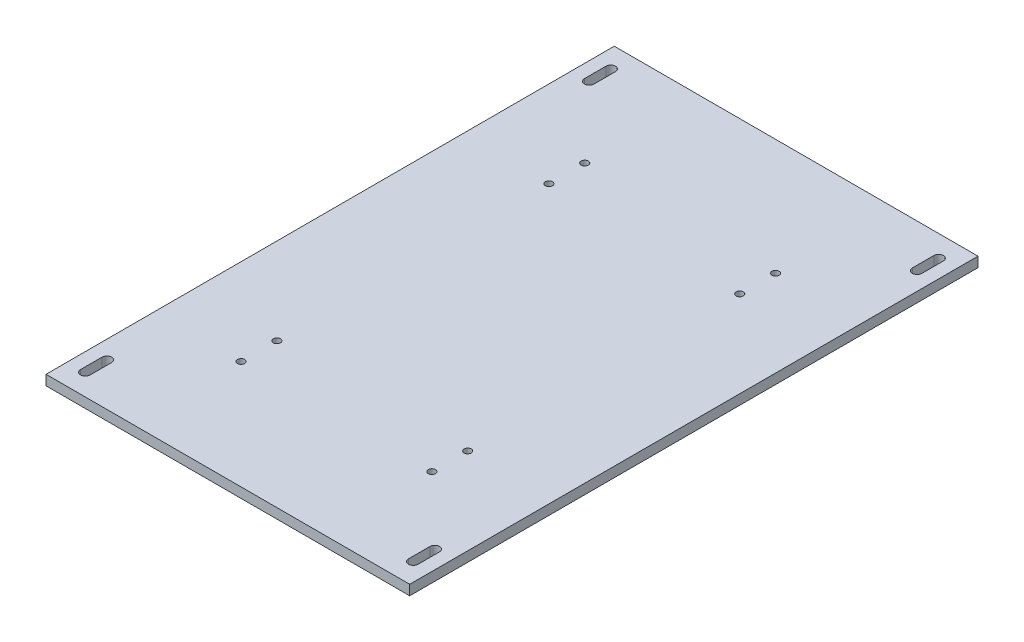
ISO-10303-21;
HEADER;
FILE_DESCRIPTION(('STEP AP214'),'2;1');
FILE_NAME('part.step','',(''),(''),'','','');
FILE_SCHEMA(('AUTOMOTIVE_DESIGN { 1 0 10303 214 1 1 1 1 }'));
ENDSEC;
DATA;
#1=APPLICATION_CONTEXT('core data for automotive mechanical design processes');
#2=APPLICATION_PROTOCOL_DEFINITION('international standard','automotive_design',2000,#1);
#3=PRODUCT_CONTEXT('',#1,'mechanical');
#4=PRODUCT('Part','Part','',(#3));
#5=PRODUCT_RELATED_PRODUCT_CATEGORY('part','',(#4));
#6=PRODUCT_DEFINITION_FORMATION('','',#4);
#7=PRODUCT_DEFINITION_CONTEXT('part definition',#1,'design');
#8=PRODUCT_DEFINITION('design','',#6,#7);
#9=PRODUCT_DEFINITION_SHAPE('','',#8);
#10=(LENGTH_UNIT() NAMED_UNIT(*) SI_UNIT(.MILLI.,.METRE.));
#11=(NAMED_UNIT(*) PLANE_ANGLE_UNIT() SI_UNIT($,.RADIAN.));
#12=(NAMED_UNIT(*) SI_UNIT($,.STERADIAN.) SOLID_ANGLE_UNIT());
#13=UNCERTAINTY_MEASURE_WITH_UNIT(LENGTH_MEASURE(1.E-05),#10,'distance_accuracy_value','');
#14=(GEOMETRIC_REPRESENTATION_CONTEXT(3) GLOBAL_UNCERTAINTY_ASSIGNED_CONTEXT((#13)) GLOBAL_UNIT_ASSIGNED_CONTEXT((#10,
#11,#12)) REPRESENTATION_CONTEXT('',''));
#15=CARTESIAN_POINT('',(0.,0.,0.));
#16=DIRECTION('',(0.,0.,1.));
#17=DIRECTION('',(1.,0.,0.));
#18=AXIS2_PLACEMENT_3D('',#15,#16,#17);
#19=CARTESIAN_POINT('',(0.,5.588,0.));
#20=DIRECTION('',(0.,-1.,0.));
#21=DIRECTION('',(0.,0.,-1.));
#22=AXIS2_PLACEMENT_3D('',#19,#20,#21);
#23=PLANE('',#22);
#24=DIRECTION('',(0.,0.,1.));
#25=VECTOR('',#24,1.);
#26=CARTESIAN_POINT('',(-88.95,5.588,146.75));
#27=LINE('',#26,#25);
#28=CARTESIAN_POINT('',(-88.95,5.588,134.75));
#29=VERTEX_POINT('',#28);
#30=CARTESIAN_POINT('',(-88.95,5.588,146.75));
#31=VERTEX_POINT('',#30);
#32=EDGE_CURVE('E184',#29,#31,#27,.T.);
#33=ORIENTED_EDGE('',*,*,#32,.T.);
#34=CARTESIAN_POINT('',(-91.6,5.588,146.75));
#35=DIRECTION('',(0.,-1.,0.));
#36=DIRECTION('',(0.,0.,1.));
#37=AXIS2_PLACEMENT_3D('',#34,#35,#36);
#38=CIRCLE('',#37,2.64999999999999);
#39=CARTESIAN_POINT('',(-94.25,5.588,146.75));
#40=VERTEX_POINT('',#39);
#41=EDGE_CURVE('E178',#31,#40,#38,.T.);
#42=ORIENTED_EDGE('',*,*,#41,.T.);
#43=DIRECTION('',(0.,0.,-1.));
#44=VECTOR('',#43,1.);
#45=CARTESIAN_POINT('',(-94.25,5.588,146.75));
#46=LINE('',#45,#44);
#47=CARTESIAN_POINT('',(-94.25,5.588,134.75));
#48=VERTEX_POINT('',#47);
#49=EDGE_CURVE('E187',#40,#48,#46,.T.);
#50=ORIENTED_EDGE('',*,*,#49,.T.);
#51=CARTESIAN_POINT('',(-91.6,5.588,134.75));
#52=DIRECTION('',(0.,-1.,0.));
#53=DIRECTION('',(0.,0.,1.));
#54=AXIS2_PLACEMENT_3D('',#51,#52,#53);
#55=CIRCLE('',#54,2.64999999999999);
#56=EDGE_CURVE('E54',#48,#29,#55,.T.);
#57=ORIENTED_EDGE('',*,*,#56,.T.);
#58=EDGE_LOOP('',(#33,#42,#50,#57));
#59=FACE_BOUND('',#58,.T.);
#60=CARTESIAN_POINT('',(91.6,5.588,146.75));
#61=DIRECTION('',(0.,1.,0.));
#62=DIRECTION('',(0.,0.,1.));
#63=AXIS2_PLACEMENT_3D('',#60,#61,#62);
#64=CIRCLE('',#63,2.64999999999999);
#65=CARTESIAN_POINT('',(88.95,5.588,146.75));
#66=VERTEX_POINT('',#65);
#67=CARTESIAN_POINT('',(94.25,5.588,146.75));
#68=VERTEX_POINT('',#67);
#69=EDGE_CURVE('E243',#66,#68,#64,.T.);
#70=ORIENTED_EDGE('',*,*,#69,.F.);
#71=DIRECTION('',(0.,0.,1.));
#72=VECTOR('',#71,1.);
#73=CARTESIAN_POINT('',(88.95,5.588,146.75));
#74=LINE('',#73,#72);
#75=CARTESIAN_POINT('',(88.95,5.588,134.75));
#76=VERTEX_POINT('',#75);
#77=EDGE_CURVE('E245',#76,#66,#74,.T.);
#78=ORIENTED_EDGE('',*,*,#77,.F.);
#79=CARTESIAN_POINT('',(91.6,5.588,134.75));
#80=DIRECTION('',(0.,1.,0.));
#81=DIRECTION('',(0.,0.,1.));
#82=AXIS2_PLACEMENT_3D('',#79,#80,#81);
#83=CIRCLE('',#82,2.64999999999999);
#84=CARTESIAN_POINT('',(94.25,5.588,134.75));
#85=VERTEX_POINT('',#84);
#86=EDGE_CURVE('E248',#85,#76,#83,.T.);
#87=ORIENTED_EDGE('',*,*,#86,.F.);
#88=DIRECTION('',(0.,0.,-1.));
#89=VECTOR('',#88,1.);
#90=CARTESIAN_POINT('',(94.25,5.588,146.75));
#91=LINE('',#90,#89);
#92=EDGE_CURVE('E251',#68,#85,#91,.T.);
#93=ORIENTED_EDGE('',*,*,#92,.F.);
#94=EDGE_LOOP('',(#70,#78,#87,#93));
#95=FACE_BOUND('',#94,.T.);
#96=DIRECTION('',(0.,0.,-1.));
#97=VECTOR('',#96,1.);
#98=CARTESIAN_POINT('',(88.95,5.588,-146.75));
#99=LINE('',#98,#97);
#100=CARTESIAN_POINT('',(88.95,5.588,-134.75));
#101=VERTEX_POINT('',#100);
#102=CARTESIAN_POINT('',(88.95,5.588,-146.75));
#103=VERTEX_POINT('',#102);
#104=EDGE_CURVE('E283',#101,#103,#99,.T.);
#105=ORIENTED_EDGE('',*,*,#104,.T.);
#106=CARTESIAN_POINT('',(91.6,5.588,-146.75));
#107=DIRECTION('',(0.,-1.,0.));
#108=DIRECTION('',(0.,0.,-1.));
#109=AXIS2_PLACEMENT_3D('',#106,#107,#108);
#110=CIRCLE('',#109,2.64999999999999);
#111=CARTESIAN_POINT('',(94.25,5.588,-146.75));
#112=VERTEX_POINT('',#111);
#113=EDGE_CURVE('E274',#103,#112,#110,.T.);
#114=ORIENTED_EDGE('',*,*,#113,.T.);
#115=DIRECTION('',(0.,0.,1.));
#116=VECTOR('',#115,1.);
#117=CARTESIAN_POINT('',(94.25,5.588,-146.75));
#118=LINE('',#117,#116);
#119=CARTESIAN_POINT('',(94.25,5.588,-134.75));
#120=VERTEX_POINT('',#119);
#121=EDGE_CURVE('E277',#112,#120,#118,.T.);
#122=ORIENTED_EDGE('',*,*,#121,.T.);
#123=CARTESIAN_POINT('',(91.6,5.588,-134.75));
#124=DIRECTION('',(0.,-1.,0.));
#125=DIRECTION('',(0.,0.,-1.));
#126=AXIS2_PLACEMENT_3D('',#123,#124,#125);
#127=CIRCLE('',#126,2.64999999999999);
#128=EDGE_CURVE('E280',#120,#101,#127,.T.);
#129=ORIENTED_EDGE('',*,*,#128,.T.);
#130=EDGE_LOOP('',(#105,#114,#122,#129));
#131=FACE_BOUND('',#130,.T.);
#132=CARTESIAN_POINT('',(-53.3,5.588,-93.936114690721));
#133=DIRECTION('',(0.,1.,0.));
#134=DIRECTION('',(0.,0.,-1.));
#135=AXIS2_PLACEMENT_3D('',#132,#133,#134);
#136=CIRCLE('',#135,1.99999999999994);
#137=CARTESIAN_POINT('',(-53.3,5.588,-95.9361146907209));
#138=VERTEX_POINT('',#137);
#139=EDGE_CURVE('E305',#138,#138,#136,.T.);
#140=ORIENTED_EDGE('',*,*,#139,.F.);
#141=EDGE_LOOP('',(#140));
#142=FACE_BOUND('',#141,.T.);
#143=CARTESIAN_POINT('',(-53.300000000425,5.588,-73.936114690721));
#144=DIRECTION('',(0.,1.,0.));
#145=DIRECTION('',(0.,0.,-1.));
#146=AXIS2_PLACEMENT_3D('',#143,#144,#145);
#147=CIRCLE('',#146,2.);
#148=CARTESIAN_POINT('',(-53.300000000425,5.588,-75.936114690721));
#149=VERTEX_POINT('',#148);
#150=EDGE_CURVE('E312',#149,#149,#147,.T.);
#151=ORIENTED_EDGE('',*,*,#150,.F.);
#152=EDGE_LOOP('',(#151));
#153=FACE_BOUND('',#152,.T.);
#154=CARTESIAN_POINT('',(-53.3000000000001,5.588,78.063885309279));
#155=DIRECTION('',(0.,1.,0.));
#156=DIRECTION('',(0.,0.,-1.));
#157=AXIS2_PLACEMENT_3D('',#154,#155,#156);
#158=CIRCLE('',#157,2.00000000406199);
#159=CARTESIAN_POINT('',(-53.3000000000001,5.588,76.063885305217));
#160=VERTEX_POINT('',#159);
#161=EDGE_CURVE('E318',#160,#160,#158,.T.);
#162=ORIENTED_EDGE('',*,*,#161,.F.);
#163=EDGE_LOOP('',(#162));
#164=FACE_BOUND('',#163,.T.);
#165=CARTESIAN_POINT('',(-53.3000000000001,5.588,98.063885309279));
#166=DIRECTION('',(0.,1.,0.));
#167=DIRECTION('',(0.,0.,-1.));
#168=AXIS2_PLACEMENT_3D('',#165,#166,#167);
#169=CIRCLE('',#168,2.);
#170=CARTESIAN_POINT('',(-53.3000000000001,5.588,96.063885309279));
#171=VERTEX_POINT('',#170);
#172=EDGE_CURVE('E324',#171,#171,#169,.T.);
#173=ORIENTED_EDGE('',*,*,#172,.F.);
#174=EDGE_LOOP('',(#173));
#175=FACE_BOUND('',#174,.T.);
#176=CARTESIAN_POINT('',(53.3,5.588,-93.936114690721));
#177=DIRECTION('',(0.,-1.,0.));
#178=DIRECTION('',(0.,0.,-1.));
#179=AXIS2_PLACEMENT_3D('',#176,#177,#178);
#180=CIRCLE('',#179,1.99999999999994);
#181=CARTESIAN_POINT('',(53.3,5.588,-95.9361146907209));
#182=VERTEX_POINT('',#181);
#183=EDGE_CURVE('E329',#182,#182,#180,.T.);
#184=ORIENTED_EDGE('',*,*,#183,.T.);
#185=EDGE_LOOP('',(#184));
#186=FACE_BOUND('',#185,.T.);
#187=CARTESIAN_POINT('',(53.300000000425,5.588,-73.936114690721));
#188=DIRECTION('',(0.,-1.,0.));
#189=DIRECTION('',(0.,0.,-1.));
#190=AXIS2_PLACEMENT_3D('',#187,#188,#189);
#191=CIRCLE('',#190,2.);
#192=CARTESIAN_POINT('',(53.300000000425,5.588,-75.936114690721));
#193=VERTEX_POINT('',#192);
#194=EDGE_CURVE('E339',#193,#193,#191,.T.);
#195=ORIENTED_EDGE('',*,*,#194,.T.);
#196=EDGE_LOOP('',(#195));
#197=FACE_BOUND('',#196,.T.);
#198=CARTESIAN_POINT('',(53.3000000000001,5.588,78.063885309279));
#199=DIRECTION('',(0.,-1.,0.));
#200=DIRECTION('',(0.,0.,-1.));
#201=AXIS2_PLACEMENT_3D('',#198,#199,#200);
#202=CIRCLE('',#201,2.00000000406199);
#203=CARTESIAN_POINT('',(53.3000000000001,5.588,76.063885305217));
#204=VERTEX_POINT('',#203);
#205=EDGE_CURVE('E345',#204,#204,#202,.T.);
#206=ORIENTED_EDGE('',*,*,#205,.T.);
#207=EDGE_LOOP('',(#206));
#208=FACE_BOUND('',#207,.T.);
#209=CARTESIAN_POINT('',(53.3000000000001,5.588,98.063885309279));
#210=DIRECTION('',(0.,-1.,0.));
#211=DIRECTION('',(0.,0.,-1.));
#212=AXIS2_PLACEMENT_3D('',#209,#210,#211);
#213=CIRCLE('',#212,2.);
#214=CARTESIAN_POINT('',(53.3000000000001,5.588,96.063885309279));
#215=VERTEX_POINT('',#214);
#216=EDGE_CURVE('E308',#215,#215,#213,.T.);
#217=ORIENTED_EDGE('',*,*,#216,.T.);
#218=EDGE_LOOP('',(#217));
#219=FACE_BOUND('',#218,.T.);
#220=DIRECTION('',(0.,0.,-1.));
#221=VECTOR('',#220,1.);
#222=CARTESIAN_POINT('',(101.6,5.588,158.75));
#223=LINE('',#222,#221);
#224=CARTESIAN_POINT('',(101.6,5.588,158.75));
#225=VERTEX_POINT('',#224);
#226=CARTESIAN_POINT('',(101.6,5.588,-158.75));
#227=VERTEX_POINT('',#226);
#228=EDGE_CURVE('E353',#225,#227,#223,.T.);
#229=ORIENTED_EDGE('',*,*,#228,.T.);
#230=DIRECTION('',(-1.,0.,0.));
#231=VECTOR('',#230,1.);
#232=CARTESIAN_POINT('',(-101.6,5.588,-158.75));
#233=LINE('',#232,#231);
#234=CARTESIAN_POINT('',(-101.6,5.588,-158.75));
#235=VERTEX_POINT('',#234);
#236=EDGE_CURVE('E356',#227,#235,#233,.T.);
#237=ORIENTED_EDGE('',*,*,#236,.T.);
#238=DIRECTION('',(0.,0.,1.));
#239=VECTOR('',#238,1.);
#240=CARTESIAN_POINT('',(-101.6,5.588,158.75));
#241=LINE('',#240,#239);
#242=CARTESIAN_POINT('',(-101.6,5.588,158.75));
#243=VERTEX_POINT('',#242);
#244=EDGE_CURVE('E359',#235,#243,#241,.T.);
#245=ORIENTED_EDGE('',*,*,#244,.T.);
#246=DIRECTION('',(1.,0.,0.));
#247=VECTOR('',#246,1.);
#248=CARTESIAN_POINT('',(-101.6,5.588,158.75));
#249=LINE('',#248,#247);
#250=EDGE_CURVE('E361',#243,#225,#249,.T.);
#251=ORIENTED_EDGE('',*,*,#250,.T.);
#252=EDGE_LOOP('',(#229,#237,#245,#251));
#253=FACE_BOUND('',#252,.T.);
#254=CARTESIAN_POINT('',(-91.6,5.588,-146.75));
#255=DIRECTION('',(0.,1.,0.));
#256=DIRECTION('',(0.,0.,-1.));
#257=AXIS2_PLACEMENT_3D('',#254,#255,#256);
#258=CIRCLE('',#257,2.64999999999999);
#259=CARTESIAN_POINT('',(-88.95,5.588,-146.75));
#260=VERTEX_POINT('',#259);
#261=CARTESIAN_POINT('',(-94.25,5.588,-146.75));
#262=VERTEX_POINT('',#261);
#263=EDGE_CURVE('E212',#260,#262,#258,.T.);
#264=ORIENTED_EDGE('',*,*,#263,.F.);
#265=DIRECTION('',(0.,0.,-1.));
#266=VECTOR('',#265,1.);
#267=CARTESIAN_POINT('',(-88.95,5.588,-146.75));
#268=LINE('',#267,#266);
#269=CARTESIAN_POINT('',(-88.95,5.588,-134.75));
#270=VERTEX_POINT('',#269);
#271=EDGE_CURVE('E214',#270,#260,#268,.T.);
#272=ORIENTED_EDGE('',*,*,#271,.F.);
#273=CARTESIAN_POINT('',(-91.6,5.588,-134.75));
#274=DIRECTION('',(0.,1.,0.));
#275=DIRECTION('',(0.,0.,-1.));
#276=AXIS2_PLACEMENT_3D('',#273,#274,#275);
#277=CIRCLE('',#276,2.64999999999999);
#278=CARTESIAN_POINT('',(-94.25,5.588,-134.75));
#279=VERTEX_POINT('',#278);
#280=EDGE_CURVE('E217',#279,#270,#277,.T.);
#281=ORIENTED_EDGE('',*,*,#280,.F.);
#282=DIRECTION('',(0.,0.,1.));
#283=VECTOR('',#282,1.);
#284=CARTESIAN_POINT('',(-94.25,5.588,-146.75));
#285=LINE('',#284,#283);
#286=EDGE_CURVE('E220',#262,#279,#285,.T.);
#287=ORIENTED_EDGE('',*,*,#286,.F.);
#288=EDGE_LOOP('',(#264,#272,#281,#287));
#289=FACE_BOUND('',#288,.T.);
#290=ADVANCED_FACE('F39',(#59,#95,#131,#142,#153,#164,#175,#186,#197,#208,#219,#253,#289),#23,.F.);
#291=CARTESIAN_POINT('',(0.,0.,0.));
#292=DIRECTION('',(0.,-1.,0.));
#293=DIRECTION('',(0.,0.,-1.));
#294=AXIS2_PLACEMENT_3D('',#291,#292,#293);
#295=PLANE('',#294);
#296=CARTESIAN_POINT('',(-91.6,0.,146.75));
#297=DIRECTION('',(0.,-1.,0.));
#298=DIRECTION('',(0.,0.,1.));
#299=AXIS2_PLACEMENT_3D('',#296,#297,#298);
#300=CIRCLE('',#299,2.64999999999999);
#301=CARTESIAN_POINT('',(-88.95,0.,146.75));
#302=VERTEX_POINT('',#301);
#303=CARTESIAN_POINT('',(-94.25,0.,146.75));
#304=VERTEX_POINT('',#303);
#305=EDGE_CURVE('E62',#302,#304,#300,.T.);
#306=ORIENTED_EDGE('',*,*,#305,.F.);
#307=DIRECTION('',(0.,0.,1.));
#308=VECTOR('',#307,1.);
#309=CARTESIAN_POINT('',(-88.95,0.,146.75));
#310=LINE('',#309,#308);
#311=CARTESIAN_POINT('',(-88.95,0.,134.75));
#312=VERTEX_POINT('',#311);
#313=EDGE_CURVE('E193',#312,#302,#310,.T.);
#314=ORIENTED_EDGE('',*,*,#313,.F.);
#315=CARTESIAN_POINT('',(-91.6,0.,134.75));
#316=DIRECTION('',(0.,-1.,0.));
#317=DIRECTION('',(0.,0.,1.));
#318=AXIS2_PLACEMENT_3D('',#315,#316,#317);
#319=CIRCLE('',#318,2.64999999999999);
#320=CARTESIAN_POINT('',(-94.25,0.,134.75));
#321=VERTEX_POINT('',#320);
#322=EDGE_CURVE('E196',#321,#312,#319,.T.);
#323=ORIENTED_EDGE('',*,*,#322,.F.);
#324=DIRECTION('',(0.,0.,-1.));
#325=VECTOR('',#324,1.);
#326=CARTESIAN_POINT('',(-94.25,0.,146.75));
#327=LINE('',#326,#325);
#328=EDGE_CURVE('E202',#304,#321,#327,.T.);
#329=ORIENTED_EDGE('',*,*,#328,.F.);
#330=EDGE_LOOP('',(#306,#314,#323,#329));
#331=FACE_BOUND('',#330,.T.);
#332=CARTESIAN_POINT('',(91.6,0.,-146.75));
#333=DIRECTION('',(0.,-1.,0.));
#334=DIRECTION('',(0.,0.,-1.));
#335=AXIS2_PLACEMENT_3D('',#332,#333,#334);
#336=CIRCLE('',#335,2.64999999999999);
#337=CARTESIAN_POINT('',(88.95,0.,-146.75));
#338=VERTEX_POINT('',#337);
#339=CARTESIAN_POINT('',(94.25,0.,-146.75));
#340=VERTEX_POINT('',#339);
#341=EDGE_CURVE('E267',#338,#340,#336,.T.);
#342=ORIENTED_EDGE('',*,*,#341,.F.);
#343=DIRECTION('',(0.,0.,-1.));
#344=VECTOR('',#343,1.);
#345=CARTESIAN_POINT('',(88.95,0.,-146.75));
#346=LINE('',#345,#344);
#347=CARTESIAN_POINT('',(88.95,0.,-134.75));
#348=VERTEX_POINT('',#347);
#349=EDGE_CURVE('E278',#348,#338,#346,.T.);
#350=ORIENTED_EDGE('',*,*,#349,.F.);
#351=CARTESIAN_POINT('',(91.6,0.,-134.75));
#352=DIRECTION('',(0.,-1.,0.));
#353=DIRECTION('',(0.,0.,-1.));
#354=AXIS2_PLACEMENT_3D('',#351,#352,#353);
#355=CIRCLE('',#354,2.64999999999999);
#356=CARTESIAN_POINT('',(94.25,0.,-134.75));
#357=VERTEX_POINT('',#356);
#358=EDGE_CURVE('E290',#357,#348,#355,.T.);
#359=ORIENTED_EDGE('',*,*,#358,.F.);
#360=DIRECTION('',(0.,0.,1.));
#361=VECTOR('',#360,1.);
#362=CARTESIAN_POINT('',(94.25,0.,-146.75));
#363=LINE('',#362,#361);
#364=EDGE_CURVE('E288',#340,#357,#363,.T.);
#365=ORIENTED_EDGE('',*,*,#364,.F.);
#366=EDGE_LOOP('',(#342,#350,#359,#365));
#367=FACE_BOUND('',#366,.T.);
#368=CARTESIAN_POINT('',(-53.3,0.,-93.936114690721));
#369=DIRECTION('',(0.,1.,0.));
#370=DIRECTION('',(0.,0.,-1.));
#371=AXIS2_PLACEMENT_3D('',#368,#369,#370);
#372=CIRCLE('',#371,1.99999999999994);
#373=CARTESIAN_POINT('',(-53.3,0.,-95.9361146907209));
#374=VERTEX_POINT('',#373);
#375=EDGE_CURVE('E309',#374,#374,#372,.T.);
#376=ORIENTED_EDGE('',*,*,#375,.T.);
#377=EDGE_LOOP('',(#376));
#378=FACE_BOUND('',#377,.T.);
#379=CARTESIAN_POINT('',(-53.300000000425,0.,-73.936114690721));
#380=DIRECTION('',(0.,1.,0.));
#381=DIRECTION('',(0.,0.,-1.));
#382=AXIS2_PLACEMENT_3D('',#379,#380,#381);
#383=CIRCLE('',#382,2.);
#384=CARTESIAN_POINT('',(-53.300000000425,0.,-75.936114690721));
#385=VERTEX_POINT('',#384);
#386=EDGE_CURVE('E315',#385,#385,#383,.T.);
#387=ORIENTED_EDGE('',*,*,#386,.T.);
#388=EDGE_LOOP('',(#387));
#389=FACE_BOUND('',#388,.T.);
#390=CARTESIAN_POINT('',(-53.3000000000001,0.,78.063885309279));
#391=DIRECTION('',(0.,1.,0.));
#392=DIRECTION('',(0.,0.,-1.));
#393=AXIS2_PLACEMENT_3D('',#390,#391,#392);
#394=CIRCLE('',#393,2.00000000406199);
#395=CARTESIAN_POINT('',(-53.3000000000001,0.,76.063885305217));
#396=VERTEX_POINT('',#395);
#397=EDGE_CURVE('E321',#396,#396,#394,.T.);
#398=ORIENTED_EDGE('',*,*,#397,.T.);
#399=EDGE_LOOP('',(#398));
#400=FACE_BOUND('',#399,.T.);
#401=CARTESIAN_POINT('',(-53.3000000000001,0.,98.063885309279));
#402=DIRECTION('',(0.,1.,0.));
#403=DIRECTION('',(0.,0.,-1.));
#404=AXIS2_PLACEMENT_3D('',#401,#402,#403);
#405=CIRCLE('',#404,2.);
#406=CARTESIAN_POINT('',(-53.3000000000001,0.,96.063885309279));
#407=VERTEX_POINT('',#406);
#408=EDGE_CURVE('E297',#407,#407,#405,.T.);
#409=ORIENTED_EDGE('',*,*,#408,.T.);
#410=EDGE_LOOP('',(#409));
#411=FACE_BOUND('',#410,.T.);
#412=CARTESIAN_POINT('',(53.3,0.,-93.936114690721));
#413=DIRECTION('',(0.,-1.,0.));
#414=DIRECTION('',(0.,0.,-1.));
#415=AXIS2_PLACEMENT_3D('',#412,#413,#414);
#416=CIRCLE('',#415,1.99999999999994);
#417=CARTESIAN_POINT('',(53.3,0.,-95.9361146907209));
#418=VERTEX_POINT('',#417);
#419=EDGE_CURVE('E333',#418,#418,#416,.T.);
#420=ORIENTED_EDGE('',*,*,#419,.F.);
#421=EDGE_LOOP('',(#420));
#422=FACE_BOUND('',#421,.T.);
#423=CARTESIAN_POINT('',(53.300000000425,0.,-73.936114690721));
#424=DIRECTION('',(0.,-1.,0.));
#425=DIRECTION('',(0.,0.,-1.));
#426=AXIS2_PLACEMENT_3D('',#423,#424,#425);
#427=CIRCLE('',#426,2.);
#428=CARTESIAN_POINT('',(53.300000000425,0.,-75.936114690721));
#429=VERTEX_POINT('',#428);
#430=EDGE_CURVE('E336',#429,#429,#427,.T.);
#431=ORIENTED_EDGE('',*,*,#430,.F.);
#432=EDGE_LOOP('',(#431));
#433=FACE_BOUND('',#432,.T.);
#434=CARTESIAN_POINT('',(53.3000000000001,0.,78.063885309279));
#435=DIRECTION('',(0.,-1.,0.));
#436=DIRECTION('',(0.,0.,-1.));
#437=AXIS2_PLACEMENT_3D('',#434,#435,#436);
#438=CIRCLE('',#437,2.00000000406199);
#439=CARTESIAN_POINT('',(53.3000000000001,0.,76.063885305217));
#440=VERTEX_POINT('',#439);
#441=EDGE_CURVE('E342',#440,#440,#438,.T.);
#442=ORIENTED_EDGE('',*,*,#441,.F.);
#443=EDGE_LOOP('',(#442));
#444=FACE_BOUND('',#443,.T.);
#445=CARTESIAN_POINT('',(53.3000000000001,0.,98.063885309279));
#446=DIRECTION('',(0.,-1.,0.));
#447=DIRECTION('',(0.,0.,-1.));
#448=AXIS2_PLACEMENT_3D('',#445,#446,#447);
#449=CIRCLE('',#448,2.);
#450=CARTESIAN_POINT('',(53.3000000000001,0.,96.063885309279));
#451=VERTEX_POINT('',#450);
#452=EDGE_CURVE('E348',#451,#451,#449,.T.);
#453=ORIENTED_EDGE('',*,*,#452,.F.);
#454=EDGE_LOOP('',(#453));
#455=FACE_BOUND('',#454,.T.);
#456=DIRECTION('',(0.,0.,-1.));
#457=VECTOR('',#456,1.);
#458=CARTESIAN_POINT('',(101.6,0.,158.75));
#459=LINE('',#458,#457);
#460=CARTESIAN_POINT('',(101.6,0.,158.75));
#461=VERTEX_POINT('',#460);
#462=CARTESIAN_POINT('',(101.6,0.,-158.75));
#463=VERTEX_POINT('',#462);
#464=EDGE_CURVE('E332',#461,#463,#459,.T.);
#465=ORIENTED_EDGE('',*,*,#464,.F.);
#466=DIRECTION('',(1.,0.,0.));
#467=VECTOR('',#466,1.);
#468=CARTESIAN_POINT('',(-101.6,0.,158.75));
#469=LINE('',#468,#467);
#470=CARTESIAN_POINT('',(-101.6,0.,158.75));
#471=VERTEX_POINT('',#470);
#472=EDGE_CURVE('E357',#471,#461,#469,.T.);
#473=ORIENTED_EDGE('',*,*,#472,.F.);
#474=DIRECTION('',(0.,0.,1.));
#475=VECTOR('',#474,1.);
#476=CARTESIAN_POINT('',(-101.6,0.,158.75));
#477=LINE('',#476,#475);
#478=CARTESIAN_POINT('',(-101.6,0.,-158.75));
#479=VERTEX_POINT('',#478);
#480=EDGE_CURVE('E368',#479,#471,#477,.T.);
#481=ORIENTED_EDGE('',*,*,#480,.F.);
#482=DIRECTION('',(-1.,0.,0.));
#483=VECTOR('',#482,1.);
#484=CARTESIAN_POINT('',(-101.6,0.,-158.75));
#485=LINE('',#484,#483);
#486=EDGE_CURVE('E366',#463,#479,#485,.T.);
#487=ORIENTED_EDGE('',*,*,#486,.F.);
#488=EDGE_LOOP('',(#465,#473,#481,#487));
#489=FACE_BOUND('',#488,.T.);
#490=DIRECTION('',(0.,0.,1.));
#491=VECTOR('',#490,1.);
#492=CARTESIAN_POINT('',(88.95,0.,146.75));
#493=LINE('',#492,#491);
#494=CARTESIAN_POINT('',(88.95,0.,134.75));
#495=VERTEX_POINT('',#494);
#496=CARTESIAN_POINT('',(88.95,0.,146.75));
#497=VERTEX_POINT('',#496);
#498=EDGE_CURVE('E256',#495,#497,#493,.T.);
#499=ORIENTED_EDGE('',*,*,#498,.T.);
#500=CARTESIAN_POINT('',(91.6,0.,146.75));
#501=DIRECTION('',(0.,1.,0.));
#502=DIRECTION('',(0.,0.,1.));
#503=AXIS2_PLACEMENT_3D('',#500,#501,#502);
#504=CIRCLE('',#503,2.64999999999999);
#505=CARTESIAN_POINT('',(94.25,0.,146.75));
#506=VERTEX_POINT('',#505);
#507=EDGE_CURVE('E236',#497,#506,#504,.T.);
#508=ORIENTED_EDGE('',*,*,#507,.T.);
#509=DIRECTION('',(0.,0.,-1.));
#510=VECTOR('',#509,1.);
#511=CARTESIAN_POINT('',(94.25,0.,146.75));
#512=LINE('',#511,#510);
#513=CARTESIAN_POINT('',(94.25,0.,134.75));
#514=VERTEX_POINT('',#513);
#515=EDGE_CURVE('E246',#506,#514,#512,.T.);
#516=ORIENTED_EDGE('',*,*,#515,.T.);
#517=CARTESIAN_POINT('',(91.6,0.,134.75));
#518=DIRECTION('',(0.,1.,0.));
#519=DIRECTION('',(0.,0.,1.));
#520=AXIS2_PLACEMENT_3D('',#517,#518,#519);
#521=CIRCLE('',#520,2.64999999999999);
#522=EDGE_CURVE('E259',#514,#495,#521,.T.);
#523=ORIENTED_EDGE('',*,*,#522,.T.);
#524=EDGE_LOOP('',(#499,#508,#516,#523));
#525=FACE_BOUND('',#524,.T.);
#526=DIRECTION('',(0.,0.,-1.));
#527=VECTOR('',#526,1.);
#528=CARTESIAN_POINT('',(-88.95,0.,-146.75));
#529=LINE('',#528,#527);
#530=CARTESIAN_POINT('',(-88.95,0.,-134.75));
#531=VERTEX_POINT('',#530);
#532=CARTESIAN_POINT('',(-88.95,0.,-146.75));
#533=VERTEX_POINT('',#532);
#534=EDGE_CURVE('E225',#531,#533,#529,.T.);
#535=ORIENTED_EDGE('',*,*,#534,.T.);
#536=CARTESIAN_POINT('',(-91.6,0.,-146.75));
#537=DIRECTION('',(0.,1.,0.));
#538=DIRECTION('',(0.,0.,-1.));
#539=AXIS2_PLACEMENT_3D('',#536,#537,#538);
#540=CIRCLE('',#539,2.64999999999999);
#541=CARTESIAN_POINT('',(-94.25,0.,-146.75));
#542=VERTEX_POINT('',#541);
#543=EDGE_CURVE('E208',#533,#542,#540,.T.);
#544=ORIENTED_EDGE('',*,*,#543,.T.);
#545=DIRECTION('',(0.,0.,1.));
#546=VECTOR('',#545,1.);
#547=CARTESIAN_POINT('',(-94.25,0.,-146.75));
#548=LINE('',#547,#546);
#549=CARTESIAN_POINT('',(-94.25,0.,-134.75));
#550=VERTEX_POINT('',#549);
#551=EDGE_CURVE('E215',#542,#550,#548,.T.);
#552=ORIENTED_EDGE('',*,*,#551,.T.);
#553=CARTESIAN_POINT('',(-91.6,0.,-134.75));
#554=DIRECTION('',(0.,1.,0.));
#555=DIRECTION('',(0.,0.,-1.));
#556=AXIS2_PLACEMENT_3D('',#553,#554,#555);
#557=CIRCLE('',#556,2.64999999999999);
#558=EDGE_CURVE('E228',#550,#531,#557,.T.);
#559=ORIENTED_EDGE('',*,*,#558,.T.);
#560=EDGE_LOOP('',(#535,#544,#552,#559));
#561=FACE_BOUND('',#560,.T.);
#562=ADVANCED_FACE('F386',(#331,#367,#378,#389,#400,#411,#422,#433,#444,#455,#489,#525,#561),
#295,.T.);
#563=CARTESIAN_POINT('',(101.6,5.588,158.75));
#564=DIRECTION('',(-1.,0.,0.));
#565=DIRECTION('',(0.,0.,1.));
#566=AXIS2_PLACEMENT_3D('',#563,#564,#565);
#567=PLANE('',#566);
#568=ORIENTED_EDGE('',*,*,#464,.T.);
#569=DIRECTION('',(0.,-1.,0.));
#570=VECTOR('',#569,1.);
#571=CARTESIAN_POINT('',(101.6,5.588,-158.75));
#572=LINE('',#571,#570);
#573=EDGE_CURVE('E11',#227,#463,#572,.T.);
#574=ORIENTED_EDGE('',*,*,#573,.F.);
#575=ORIENTED_EDGE('',*,*,#228,.F.);
#576=DIRECTION('',(0.,-1.,0.));
#577=VECTOR('',#576,1.);
#578=CARTESIAN_POINT('',(101.6,5.588,158.75));
#579=LINE('',#578,#577);
#580=EDGE_CURVE('E363',#225,#461,#579,.T.);
#581=ORIENTED_EDGE('',*,*,#580,.T.);
#582=EDGE_LOOP('',(#568,#574,#575,#581));
#583=FACE_BOUND('',#582,.T.);
#584=ADVANCED_FACE('F41',(#583),#567,.F.);
#585=CARTESIAN_POINT('',(-101.6,5.588,-158.75));
#586=DIRECTION('',(0.,0.,1.));
#587=DIRECTION('',(1.,0.,0.));
#588=AXIS2_PLACEMENT_3D('',#585,#586,#587);
#589=PLANE('',#588);
#590=ORIENTED_EDGE('',*,*,#486,.T.);
#591=DIRECTION('',(0.,-1.,0.));
#592=VECTOR('',#591,1.);
#593=CARTESIAN_POINT('',(-101.6,5.588,-158.75));
#594=LINE('',#593,#592);
#595=EDGE_CURVE('E47',#235,#479,#594,.T.);
#596=ORIENTED_EDGE('',*,*,#595,.F.);
#597=ORIENTED_EDGE('',*,*,#236,.F.);
#598=ORIENTED_EDGE('',*,*,#573,.T.);
#599=EDGE_LOOP('',(#590,#596,#597,#598));
#600=FACE_BOUND('',#599,.T.);
#601=ADVANCED_FACE('F397',(#600),#589,.F.);
#602=CARTESIAN_POINT('',(-101.6,5.588,158.75));
#603=DIRECTION('',(1.,0.,0.));
#604=DIRECTION('',(0.,0.,-1.));
#605=AXIS2_PLACEMENT_3D('',#602,#603,#604);
#606=PLANE('',#605);
#607=ORIENTED_EDGE('',*,*,#480,.T.);
#608=DIRECTION('',(0.,-1.,0.));
#609=VECTOR('',#608,1.);
#610=CARTESIAN_POINT('',(-101.6,5.588,158.75));
#611=LINE('',#610,#609);
#612=EDGE_CURVE('E373',#243,#471,#611,.T.);
#613=ORIENTED_EDGE('',*,*,#612,.F.);
#614=ORIENTED_EDGE('',*,*,#244,.F.);
#615=ORIENTED_EDGE('',*,*,#595,.T.);
#616=EDGE_LOOP('',(#607,#613,#614,#615));
#617=FACE_BOUND('',#616,.T.);
#618=ADVANCED_FACE('F380',(#617),#606,.F.);
#619=CARTESIAN_POINT('',(-101.6,5.588,158.75));
#620=DIRECTION('',(0.,0.,-1.));
#621=DIRECTION('',(-1.,0.,0.));
#622=AXIS2_PLACEMENT_3D('',#619,#620,#621);
#623=PLANE('',#622);
#624=ORIENTED_EDGE('',*,*,#472,.T.);
#625=ORIENTED_EDGE('',*,*,#580,.F.);
#626=ORIENTED_EDGE('',*,*,#250,.F.);
#627=ORIENTED_EDGE('',*,*,#612,.T.);
#628=EDGE_LOOP('',(#624,#625,#626,#627));
#629=FACE_BOUND('',#628,.T.);
#630=ADVANCED_FACE('F390',(#629),#623,.F.);
#631=CARTESIAN_POINT('',(53.3000000000001,5.588,98.063885309279));
#632=DIRECTION('',(0.,-1.,0.));
#633=DIRECTION('',(0.,0.,-1.));
#634=AXIS2_PLACEMENT_3D('',#631,#632,#633);
#635=CYLINDRICAL_SURFACE('',#634,2.);
#636=ORIENTED_EDGE('',*,*,#216,.F.);
#637=EDGE_LOOP('',(#636));
#638=FACE_BOUND('',#637,.T.);
#639=ORIENTED_EDGE('',*,*,#452,.T.);
#640=EDGE_LOOP('',(#639));
#641=FACE_BOUND('',#640,.T.);
#642=ADVANCED_FACE('F412',(#638,#641),#635,.F.);
#643=CARTESIAN_POINT('',(53.3000000000001,5.588,78.063885309279));
#644=DIRECTION('',(0.,-1.,0.));
#645=DIRECTION('',(0.,0.,-1.));
#646=AXIS2_PLACEMENT_3D('',#643,#644,#645);
#647=CYLINDRICAL_SURFACE('',#646,2.00000000406199);
#648=ORIENTED_EDGE('',*,*,#205,.F.);
#649=EDGE_LOOP('',(#648));
#650=FACE_BOUND('',#649,.T.);
#651=ORIENTED_EDGE('',*,*,#441,.T.);
#652=EDGE_LOOP('',(#651));
#653=FACE_BOUND('',#652,.T.);
#654=ADVANCED_FACE('F419',(#650,#653),#647,.F.);
#655=CARTESIAN_POINT('',(53.300000000425,5.588,-73.936114690721));
#656=DIRECTION('',(0.,-1.,0.));
#657=DIRECTION('',(0.,0.,-1.));
#658=AXIS2_PLACEMENT_3D('',#655,#656,#657);
#659=CYLINDRICAL_SURFACE('',#658,2.);
#660=ORIENTED_EDGE('',*,*,#194,.F.);
#661=EDGE_LOOP('',(#660));
#662=FACE_BOUND('',#661,.T.);
#663=ORIENTED_EDGE('',*,*,#430,.T.);
#664=EDGE_LOOP('',(#663));
#665=FACE_BOUND('',#664,.T.);
#666=ADVANCED_FACE('F424',(#662,#665),#659,.F.);
#667=CARTESIAN_POINT('',(53.3,5.588,-93.936114690721));
#668=DIRECTION('',(0.,-1.,0.));
#669=DIRECTION('',(0.,0.,-1.));
#670=AXIS2_PLACEMENT_3D('',#667,#668,#669);
#671=CYLINDRICAL_SURFACE('',#670,1.99999999999994);
#672=ORIENTED_EDGE('',*,*,#183,.F.);
#673=EDGE_LOOP('',(#672));
#674=FACE_BOUND('',#673,.T.);
#675=ORIENTED_EDGE('',*,*,#419,.T.);
#676=EDGE_LOOP('',(#675));
#677=FACE_BOUND('',#676,.T.);
#678=ADVANCED_FACE('F434',(#674,#677),#671,.F.);
#679=CARTESIAN_POINT('',(-53.3000000000001,5.588,98.063885309279));
#680=DIRECTION('',(0.,-1.,0.));
#681=DIRECTION('',(0.,0.,-1.));
#682=AXIS2_PLACEMENT_3D('',#679,#680,#681);
#683=CYLINDRICAL_SURFACE('',#682,2.);
#684=ORIENTED_EDGE('',*,*,#172,.T.);
#685=EDGE_LOOP('',(#684));
#686=FACE_BOUND('',#685,.T.);
#687=ORIENTED_EDGE('',*,*,#408,.F.);
#688=EDGE_LOOP('',(#687));
#689=FACE_BOUND('',#688,.T.);
#690=ADVANCED_FACE('F442',(#686,#689),#683,.F.);
#691=CARTESIAN_POINT('',(-53.3000000000001,5.588,78.063885309279));
#692=DIRECTION('',(0.,-1.,0.));
#693=DIRECTION('',(0.,0.,-1.));
#694=AXIS2_PLACEMENT_3D('',#691,#692,#693);
#695=CYLINDRICAL_SURFACE('',#694,2.00000000406199);
#696=ORIENTED_EDGE('',*,*,#161,.T.);
#697=EDGE_LOOP('',(#696));
#698=FACE_BOUND('',#697,.T.);
#699=ORIENTED_EDGE('',*,*,#397,.F.);
#700=EDGE_LOOP('',(#699));
#701=FACE_BOUND('',#700,.T.);
#702=ADVANCED_FACE('F446',(#698,#701),#695,.F.);
#703=CARTESIAN_POINT('',(-53.300000000425,5.588,-73.936114690721));
#704=DIRECTION('',(0.,-1.,0.));
#705=DIRECTION('',(0.,0.,-1.));
#706=AXIS2_PLACEMENT_3D('',#703,#704,#705);
#707=CYLINDRICAL_SURFACE('',#706,2.);
#708=ORIENTED_EDGE('',*,*,#150,.T.);
#709=EDGE_LOOP('',(#708));
#710=FACE_BOUND('',#709,.T.);
#711=ORIENTED_EDGE('',*,*,#386,.F.);
#712=EDGE_LOOP('',(#711));
#713=FACE_BOUND('',#712,.T.);
#714=ADVANCED_FACE('F450',(#710,#713),#707,.F.);
#715=CARTESIAN_POINT('',(-53.3,5.588,-93.936114690721));
#716=DIRECTION('',(0.,-1.,0.));
#717=DIRECTION('',(0.,0.,-1.));
#718=AXIS2_PLACEMENT_3D('',#715,#716,#717);
#719=CYLINDRICAL_SURFACE('',#718,1.99999999999994);
#720=ORIENTED_EDGE('',*,*,#139,.T.);
#721=EDGE_LOOP('',(#720));
#722=FACE_BOUND('',#721,.T.);
#723=ORIENTED_EDGE('',*,*,#375,.F.);
#724=EDGE_LOOP('',(#723));
#725=FACE_BOUND('',#724,.T.);
#726=ADVANCED_FACE('F454',(#722,#725),#719,.F.);
#727=CARTESIAN_POINT('',(88.95,5.588,-146.75));
#728=DIRECTION('',(-1.,0.,0.));
#729=DIRECTION('',(0.,0.,1.));
#730=AXIS2_PLACEMENT_3D('',#727,#728,#729);
#731=PLANE('',#730);
#732=ORIENTED_EDGE('',*,*,#104,.F.);
#733=DIRECTION('',(0.,-1.,0.));
#734=VECTOR('',#733,1.);
#735=CARTESIAN_POINT('',(88.95,5.588,-134.75));
#736=LINE('',#735,#734);
#737=EDGE_CURVE('E298',#101,#348,#736,.T.);
#738=ORIENTED_EDGE('',*,*,#737,.T.);
#739=ORIENTED_EDGE('',*,*,#349,.T.);
#740=DIRECTION('',(0.,-1.,0.));
#741=VECTOR('',#740,1.);
#742=CARTESIAN_POINT('',(88.95,5.588,-146.75));
#743=LINE('',#742,#741);
#744=EDGE_CURVE('E294',#103,#338,#743,.T.);
#745=ORIENTED_EDGE('',*,*,#744,.F.);
#746=EDGE_LOOP('',(#732,#738,#739,#745));
#747=FACE_BOUND('',#746,.T.);
#748=ADVANCED_FACE('F458',(#747),#731,.F.);
#749=CARTESIAN_POINT('',(94.25,5.588,-146.75));
#750=DIRECTION('',(1.,0.,0.));
#751=DIRECTION('',(0.,0.,-1.));
#752=AXIS2_PLACEMENT_3D('',#749,#750,#751);
#753=PLANE('',#752);
#754=ORIENTED_EDGE('',*,*,#121,.F.);
#755=DIRECTION('',(0.,-1.,0.));
#756=VECTOR('',#755,1.);
#757=CARTESIAN_POINT('',(94.25,5.588,-146.75));
#758=LINE('',#757,#756);
#759=EDGE_CURVE('E285',#112,#340,#758,.T.);
#760=ORIENTED_EDGE('',*,*,#759,.T.);
#761=ORIENTED_EDGE('',*,*,#364,.T.);
#762=DIRECTION('',(0.,-1.,0.));
#763=VECTOR('',#762,1.);
#764=CARTESIAN_POINT('',(94.25,5.588,-134.75));
#765=LINE('',#764,#763);
#766=EDGE_CURVE('E300',#120,#357,#765,.T.);
#767=ORIENTED_EDGE('',*,*,#766,.F.);
#768=EDGE_LOOP('',(#754,#760,#761,#767));
#769=FACE_BOUND('',#768,.T.);
#770=ADVANCED_FACE('F464',(#769),#753,.F.);
#771=CARTESIAN_POINT('',(91.6,5.588,-146.75));
#772=DIRECTION('',(0.,-1.,0.));
#773=DIRECTION('',(0.,0.,-1.));
#774=AXIS2_PLACEMENT_3D('',#771,#772,#773);
#775=CYLINDRICAL_SURFACE('',#774,2.64999999999999);
#776=ORIENTED_EDGE('',*,*,#341,.T.);
#777=ORIENTED_EDGE('',*,*,#759,.F.);
#778=ORIENTED_EDGE('',*,*,#113,.F.);
#779=ORIENTED_EDGE('',*,*,#744,.T.);
#780=EDGE_LOOP('',(#776,#777,#778,#779));
#781=FACE_BOUND('',#780,.T.);
#782=ADVANCED_FACE('F460',(#781),#775,.F.);
#783=CARTESIAN_POINT('',(91.6,5.588,-134.75));
#784=DIRECTION('',(0.,-1.,0.));
#785=DIRECTION('',(0.,0.,-1.));
#786=AXIS2_PLACEMENT_3D('',#783,#784,#785);
#787=CYLINDRICAL_SURFACE('',#786,2.64999999999999);
#788=ORIENTED_EDGE('',*,*,#358,.T.);
#789=ORIENTED_EDGE('',*,*,#737,.F.);
#790=ORIENTED_EDGE('',*,*,#128,.F.);
#791=ORIENTED_EDGE('',*,*,#766,.T.);
#792=EDGE_LOOP('',(#788,#789,#790,#791));
#793=FACE_BOUND('',#792,.T.);
#794=ADVANCED_FACE('F463',(#793),#787,.F.);
#795=CARTESIAN_POINT('',(91.6,5.588,146.75));
#796=DIRECTION('',(0.,-1.,0.));
#797=DIRECTION('',(0.,0.,-1.));
#798=AXIS2_PLACEMENT_3D('',#795,#796,#797);
#799=CYLINDRICAL_SURFACE('',#798,2.64999999999999);
#800=ORIENTED_EDGE('',*,*,#507,.F.);
#801=DIRECTION('',(0.,-1.,0.));
#802=VECTOR('',#801,1.);
#803=CARTESIAN_POINT('',(88.95,5.588,146.75));
#804=LINE('',#803,#802);
#805=EDGE_CURVE('E253',#66,#497,#804,.T.);
#806=ORIENTED_EDGE('',*,*,#805,.F.);
#807=ORIENTED_EDGE('',*,*,#69,.T.);
#808=DIRECTION('',(0.,-1.,0.));
#809=VECTOR('',#808,1.);
#810=CARTESIAN_POINT('',(94.25,5.588,146.75));
#811=LINE('',#810,#809);
#812=EDGE_CURVE('E264',#68,#506,#811,.T.);
#813=ORIENTED_EDGE('',*,*,#812,.T.);
#814=EDGE_LOOP('',(#800,#806,#807,#813));
#815=FACE_BOUND('',#814,.T.);
#816=ADVANCED_FACE('F471',(#815),#799,.F.);
#817=CARTESIAN_POINT('',(94.25,5.588,146.75));
#818=DIRECTION('',(-1.,0.,0.));
#819=DIRECTION('',(0.,0.,1.));
#820=AXIS2_PLACEMENT_3D('',#817,#818,#819);
#821=PLANE('',#820);
#822=ORIENTED_EDGE('',*,*,#515,.F.);
#823=ORIENTED_EDGE('',*,*,#812,.F.);
#824=ORIENTED_EDGE('',*,*,#92,.T.);
#825=DIRECTION('',(0.,-1.,0.));
#826=VECTOR('',#825,1.);
#827=CARTESIAN_POINT('',(94.25,5.588,134.75));
#828=LINE('',#827,#826);
#829=EDGE_CURVE('E268',#85,#514,#828,.T.);
#830=ORIENTED_EDGE('',*,*,#829,.T.);
#831=EDGE_LOOP('',(#822,#823,#824,#830));
#832=FACE_BOUND('',#831,.T.);
#833=ADVANCED_FACE('F478',(#832),#821,.T.);
#834=CARTESIAN_POINT('',(91.6,5.588,134.75));
#835=DIRECTION('',(0.,-1.,0.));
#836=DIRECTION('',(0.,0.,-1.));
#837=AXIS2_PLACEMENT_3D('',#834,#835,#836);
#838=CYLINDRICAL_SURFACE('',#837,2.64999999999999);
#839=ORIENTED_EDGE('',*,*,#522,.F.);
#840=ORIENTED_EDGE('',*,*,#829,.F.);
#841=ORIENTED_EDGE('',*,*,#86,.T.);
#842=DIRECTION('',(0.,-1.,0.));
#843=VECTOR('',#842,1.);
#844=CARTESIAN_POINT('',(88.95,5.588,134.75));
#845=LINE('',#844,#843);
#846=EDGE_CURVE('E270',#76,#495,#845,.T.);
#847=ORIENTED_EDGE('',*,*,#846,.T.);
#848=EDGE_LOOP('',(#839,#840,#841,#847));
#849=FACE_BOUND('',#848,.T.);
#850=ADVANCED_FACE('F484',(#849),#838,.F.);
#851=CARTESIAN_POINT('',(88.95,5.588,146.75));
#852=DIRECTION('',(1.,0.,0.));
#853=DIRECTION('',(0.,0.,-1.));
#854=AXIS2_PLACEMENT_3D('',#851,#852,#853);
#855=PLANE('',#854);
#856=ORIENTED_EDGE('',*,*,#498,.F.);
#857=ORIENTED_EDGE('',*,*,#846,.F.);
#858=ORIENTED_EDGE('',*,*,#77,.T.);
#859=ORIENTED_EDGE('',*,*,#805,.T.);
#860=EDGE_LOOP('',(#856,#857,#858,#859));
#861=FACE_BOUND('',#860,.T.);
#862=ADVANCED_FACE('F480',(#861),#855,.T.);
#863=CARTESIAN_POINT('',(-91.6,5.588,-146.75));
#864=DIRECTION('',(0.,-1.,0.));
#865=DIRECTION('',(0.,0.,-1.));
#866=AXIS2_PLACEMENT_3D('',#863,#864,#865);
#867=CYLINDRICAL_SURFACE('',#866,2.64999999999999);
#868=ORIENTED_EDGE('',*,*,#543,.F.);
#869=DIRECTION('',(0.,-1.,0.));
#870=VECTOR('',#869,1.);
#871=CARTESIAN_POINT('',(-88.95,5.588,-146.75));
#872=LINE('',#871,#870);
#873=EDGE_CURVE('E222',#260,#533,#872,.T.);
#874=ORIENTED_EDGE('',*,*,#873,.F.);
#875=ORIENTED_EDGE('',*,*,#263,.T.);
#876=DIRECTION('',(0.,-1.,0.));
#877=VECTOR('',#876,1.);
#878=CARTESIAN_POINT('',(-94.25,5.588,-146.75));
#879=LINE('',#878,#877);
#880=EDGE_CURVE('E233',#262,#542,#879,.T.);
#881=ORIENTED_EDGE('',*,*,#880,.T.);
#882=EDGE_LOOP('',(#868,#874,#875,#881));
#883=FACE_BOUND('',#882,.T.);
#884=ADVANCED_FACE('F483',(#883),#867,.F.);
#885=CARTESIAN_POINT('',(-94.25,5.588,-146.75));
#886=DIRECTION('',(1.,0.,0.));
#887=DIRECTION('',(0.,0.,-1.));
#888=AXIS2_PLACEMENT_3D('',#885,#886,#887);
#889=PLANE('',#888);
#890=ORIENTED_EDGE('',*,*,#551,.F.);
#891=ORIENTED_EDGE('',*,*,#880,.F.);
#892=ORIENTED_EDGE('',*,*,#286,.T.);
#893=DIRECTION('',(0.,-1.,0.));
#894=VECTOR('',#893,1.);
#895=CARTESIAN_POINT('',(-94.25,5.588,-134.75));
#896=LINE('',#895,#894);
#897=EDGE_CURVE('E237',#279,#550,#896,.T.);
#898=ORIENTED_EDGE('',*,*,#897,.T.);
#899=EDGE_LOOP('',(#890,#891,#892,#898));
#900=FACE_BOUND('',#899,.T.);
#901=ADVANCED_FACE('F494',(#900),#889,.T.);
#902=CARTESIAN_POINT('',(-91.6,5.588,-134.75));
#903=DIRECTION('',(0.,-1.,0.));
#904=DIRECTION('',(0.,0.,-1.));
#905=AXIS2_PLACEMENT_3D('',#902,#903,#904);
#906=CYLINDRICAL_SURFACE('',#905,2.64999999999999);
#907=ORIENTED_EDGE('',*,*,#558,.F.);
#908=ORIENTED_EDGE('',*,*,#897,.F.);
#909=ORIENTED_EDGE('',*,*,#280,.T.);
#910=DIRECTION('',(0.,-1.,0.));
#911=VECTOR('',#910,1.);
#912=CARTESIAN_POINT('',(-88.95,5.588,-134.75));
#913=LINE('',#912,#911);
#914=EDGE_CURVE('E239',#270,#531,#913,.T.);
#915=ORIENTED_EDGE('',*,*,#914,.T.);
#916=EDGE_LOOP('',(#907,#908,#909,#915));
#917=FACE_BOUND('',#916,.T.);
#918=ADVANCED_FACE('F499',(#917),#906,.F.);
#919=CARTESIAN_POINT('',(-88.95,5.588,-146.75));
#920=DIRECTION('',(-1.,0.,0.));
#921=DIRECTION('',(0.,0.,1.));
#922=AXIS2_PLACEMENT_3D('',#919,#920,#921);
#923=PLANE('',#922);
#924=ORIENTED_EDGE('',*,*,#534,.F.);
#925=ORIENTED_EDGE('',*,*,#914,.F.);
#926=ORIENTED_EDGE('',*,*,#271,.T.);
#927=ORIENTED_EDGE('',*,*,#873,.T.);
#928=EDGE_LOOP('',(#924,#925,#926,#927));
#929=FACE_BOUND('',#928,.T.);
#930=ADVANCED_FACE('F496',(#929),#923,.T.);
#931=CARTESIAN_POINT('',(-91.6,5.588,146.75));
#932=DIRECTION('',(0.,-1.,0.));
#933=DIRECTION('',(0.,0.,-1.));
#934=AXIS2_PLACEMENT_3D('',#931,#932,#933);
#935=CYLINDRICAL_SURFACE('',#934,2.64999999999999);
#936=ORIENTED_EDGE('',*,*,#305,.T.);
#937=DIRECTION('',(0.,-1.,0.));
#938=VECTOR('',#937,1.);
#939=CARTESIAN_POINT('',(-94.25,5.588,146.75));
#940=LINE('',#939,#938);
#941=EDGE_CURVE('E174',#40,#304,#940,.T.);
#942=ORIENTED_EDGE('',*,*,#941,.F.);
#943=ORIENTED_EDGE('',*,*,#41,.F.);
#944=DIRECTION('',(0.,-1.,0.));
#945=VECTOR('',#944,1.);
#946=CARTESIAN_POINT('',(-88.95,5.588,146.75));
#947=LINE('',#946,#945);
#948=EDGE_CURVE('E206',#31,#302,#947,.T.);
#949=ORIENTED_EDGE('',*,*,#948,.T.);
#950=EDGE_LOOP('',(#936,#942,#943,#949));
#951=FACE_BOUND('',#950,.T.);
#952=ADVANCED_FACE('F176',(#951),#935,.F.);
#953=CARTESIAN_POINT('',(-88.95,5.588,146.75));
#954=DIRECTION('',(1.,0.,0.));
#955=DIRECTION('',(0.,0.,-1.));
#956=AXIS2_PLACEMENT_3D('',#953,#954,#955);
#957=PLANE('',#956);
#958=ORIENTED_EDGE('',*,*,#313,.T.);
#959=ORIENTED_EDGE('',*,*,#948,.F.);
#960=ORIENTED_EDGE('',*,*,#32,.F.);
#961=DIRECTION('',(0.,-1.,0.));
#962=VECTOR('',#961,1.);
#963=CARTESIAN_POINT('',(-88.95,5.588,134.75));
#964=LINE('',#963,#962);
#965=EDGE_CURVE('E209',#29,#312,#964,.T.);
#966=ORIENTED_EDGE('',*,*,#965,.T.);
#967=EDGE_LOOP('',(#958,#959,#960,#966));
#968=FACE_BOUND('',#967,.T.);
#969=ADVANCED_FACE('F509',(#968),#957,.F.);
#970=CARTESIAN_POINT('',(-91.6,5.588,134.75));
#971=DIRECTION('',(0.,-1.,0.));
#972=DIRECTION('',(0.,0.,-1.));
#973=AXIS2_PLACEMENT_3D('',#970,#971,#972);
#974=CYLINDRICAL_SURFACE('',#973,2.64999999999999);
#975=ORIENTED_EDGE('',*,*,#322,.T.);
#976=ORIENTED_EDGE('',*,*,#965,.F.);
#977=ORIENTED_EDGE('',*,*,#56,.F.);
#978=DIRECTION('',(0.,-1.,0.));
#979=VECTOR('',#978,1.);
#980=CARTESIAN_POINT('',(-94.25,5.588,134.75));
#981=LINE('',#980,#979);
#982=EDGE_CURVE('E183',#48,#321,#981,.T.);
#983=ORIENTED_EDGE('',*,*,#982,.T.);
#984=EDGE_LOOP('',(#975,#976,#977,#983));
#985=FACE_BOUND('',#984,.T.);
#986=ADVANCED_FACE('F512',(#985),#974,.F.);
#987=CARTESIAN_POINT('',(-94.25,5.588,146.75));
#988=DIRECTION('',(-1.,0.,0.));
#989=DIRECTION('',(0.,0.,1.));
#990=AXIS2_PLACEMENT_3D('',#987,#988,#989);
#991=PLANE('',#990);
#992=ORIENTED_EDGE('',*,*,#328,.T.);
#993=ORIENTED_EDGE('',*,*,#982,.F.);
#994=ORIENTED_EDGE('',*,*,#49,.F.);
#995=ORIENTED_EDGE('',*,*,#941,.T.);
#996=EDGE_LOOP('',(#992,#993,#994,#995));
#997=FACE_BOUND('',#996,.T.);
#998=ADVANCED_FACE('F188',(#997),#991,.F.);
#999=CLOSED_SHELL('',(#290,#562,#584,#601,#618,#630,#642,#654,#666,#678,#690,#702,#714,#726,
#748,#770,#782,#794,#816,#833,#850,#862,#884,#901,#918,#930,#952,#969,#986,#998));
#1000=MANIFOLD_SOLID_BREP('B2',#999);
#1001=ADVANCED_BREP_SHAPE_REPRESENTATION('',(#18,#1000),#14);
#1002=SHAPE_DEFINITION_REPRESENTATION(#9,#1001);
ENDSEC;
END-ISO-10303-21;
